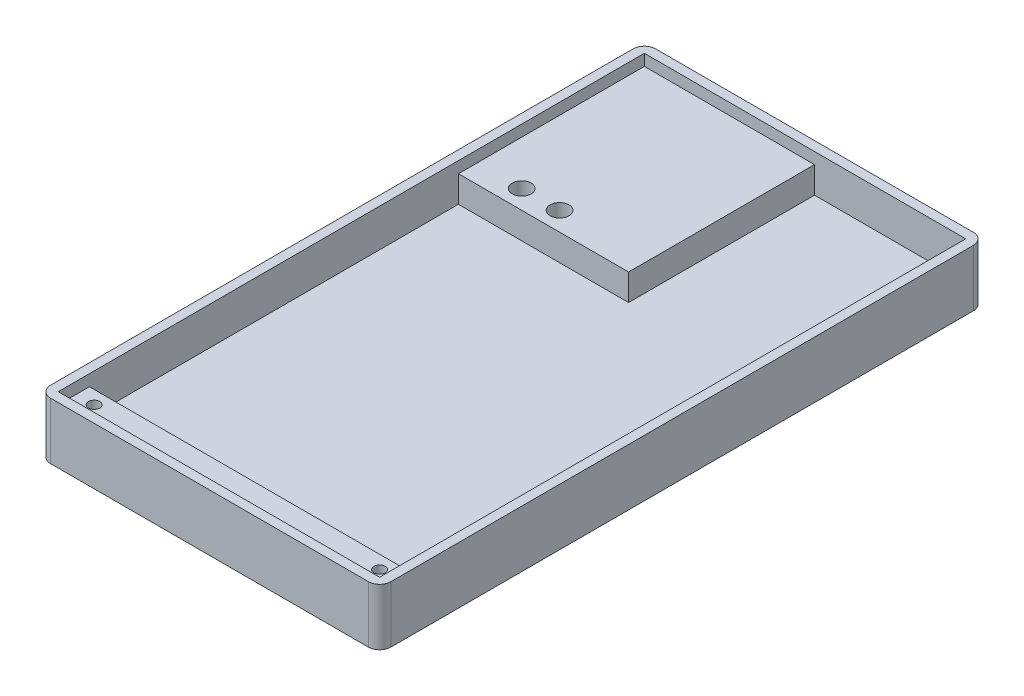
ISO-10303-21;
HEADER;
FILE_DESCRIPTION(('STEP AP214'),'2;1');
FILE_NAME('part.step','',(''),(''),'','','');
FILE_SCHEMA(('AUTOMOTIVE_DESIGN { 1 0 10303 214 1 1 1 1 }'));
ENDSEC;
DATA;
#1=APPLICATION_CONTEXT('core data for automotive mechanical design processes');
#2=APPLICATION_PROTOCOL_DEFINITION('international standard','automotive_design',2000,#1);
#3=PRODUCT_CONTEXT('',#1,'mechanical');
#4=PRODUCT('Part','Part','',(#3));
#5=PRODUCT_RELATED_PRODUCT_CATEGORY('part','',(#4));
#6=PRODUCT_DEFINITION_FORMATION('','',#4);
#7=PRODUCT_DEFINITION_CONTEXT('part definition',#1,'design');
#8=PRODUCT_DEFINITION('design','',#6,#7);
#9=PRODUCT_DEFINITION_SHAPE('','',#8);
#10=(LENGTH_UNIT() NAMED_UNIT(*) SI_UNIT(.MILLI.,.METRE.));
#11=(NAMED_UNIT(*) PLANE_ANGLE_UNIT() SI_UNIT($,.RADIAN.));
#12=(NAMED_UNIT(*) SI_UNIT($,.STERADIAN.) SOLID_ANGLE_UNIT());
#13=UNCERTAINTY_MEASURE_WITH_UNIT(LENGTH_MEASURE(1.E-05),#10,'distance_accuracy_value','');
#14=(GEOMETRIC_REPRESENTATION_CONTEXT(3) GLOBAL_UNCERTAINTY_ASSIGNED_CONTEXT((#13)) GLOBAL_UNIT_ASSIGNED_CONTEXT((#10,
#11,#12)) REPRESENTATION_CONTEXT('',''));
#15=CARTESIAN_POINT('',(0.,0.,0.));
#16=DIRECTION('',(0.,0.,1.));
#17=DIRECTION('',(1.,0.,0.));
#18=AXIS2_PLACEMENT_3D('',#15,#16,#17);
#19=CARTESIAN_POINT('',(-40.7731376975169,15.,-49.3058690744921));
#20=DIRECTION('',(1.,0.,0.));
#21=DIRECTION('',(0.,0.,-1.));
#22=AXIS2_PLACEMENT_3D('',#19,#20,#21);
#23=PLANE('',#22);
#24=DIRECTION('',(0.,0.,1.));
#25=VECTOR('',#24,1.);
#26=CARTESIAN_POINT('',(-40.7731376975169,5.,-49.3058690744921));
#27=LINE('',#26,#25);
#28=CARTESIAN_POINT('',(-40.7731376975169,5.,-0.130869074492097));
#29=VERTEX_POINT('',#28);
#30=CARTESIAN_POINT('',(-40.7731376975169,5.,97.4441309255079));
#31=VERTEX_POINT('',#30);
#32=EDGE_CURVE('E481',#29,#31,#27,.T.);
#33=ORIENTED_EDGE('',*,*,#32,.F.);
#34=DIRECTION('',(0.,-1.,0.));
#35=VECTOR('',#34,1.);
#36=CARTESIAN_POINT('',(-40.7731376975169,78.657187346902,-0.130869074492097));
#37=LINE('',#36,#35);
#38=CARTESIAN_POINT('',(-40.7731376975169,12.,-0.130869074492097));
#39=VERTEX_POINT('',#38);
#40=EDGE_CURVE('E186',#39,#29,#37,.T.);
#41=ORIENTED_EDGE('',*,*,#40,.F.);
#42=DIRECTION('',(0.,0.,-1.));
#43=VECTOR('',#42,1.);
#44=CARTESIAN_POINT('',(-40.7731376975169,12.,0.));
#45=LINE('',#44,#43);
#46=CARTESIAN_POINT('',(-40.7731376975169,12.,-49.3058690744921));
#47=VERTEX_POINT('',#46);
#48=EDGE_CURVE('E168',#39,#47,#45,.T.);
#49=ORIENTED_EDGE('',*,*,#48,.T.);
#50=DIRECTION('',(0.,-1.,0.));
#51=VECTOR('',#50,1.);
#52=CARTESIAN_POINT('',(-40.7731376975169,15.,-49.3058690744921));
#53=LINE('',#52,#51);
#54=CARTESIAN_POINT('',(-40.7731376975169,15.,-49.3058690744921));
#55=VERTEX_POINT('',#54);
#56=EDGE_CURVE('E184',#55,#47,#53,.T.);
#57=ORIENTED_EDGE('',*,*,#56,.F.);
#58=DIRECTION('',(0.,0.,1.));
#59=VECTOR('',#58,1.);
#60=CARTESIAN_POINT('',(-40.7731376975169,15.,-49.3058690744921));
#61=LINE('',#60,#59);
#62=CARTESIAN_POINT('',(-40.7731376975169,15.,105.694130925508));
#63=VERTEX_POINT('',#62);
#64=EDGE_CURVE('E492',#55,#63,#61,.T.);
#65=ORIENTED_EDGE('',*,*,#64,.T.);
#66=DIRECTION('',(0.,-1.,0.));
#67=VECTOR('',#66,1.);
#68=CARTESIAN_POINT('',(-40.7731376975169,15.,105.694130925508));
#69=LINE('',#68,#67);
#70=CARTESIAN_POINT('',(-40.7731376975169,12.,105.694130925508));
#71=VERTEX_POINT('',#70);
#72=EDGE_CURVE('E211',#63,#71,#69,.T.);
#73=ORIENTED_EDGE('',*,*,#72,.T.);
#74=DIRECTION('',(0.,0.,1.));
#75=VECTOR('',#74,1.);
#76=CARTESIAN_POINT('',(-40.7731376975169,12.,105.694130925508));
#77=LINE('',#76,#75);
#78=CARTESIAN_POINT('',(-40.7731376975169,12.,97.4441309255079));
#79=VERTEX_POINT('',#78);
#80=EDGE_CURVE('E534',#79,#71,#77,.T.);
#81=ORIENTED_EDGE('',*,*,#80,.F.);
#82=DIRECTION('',(0.,-1.,0.));
#83=VECTOR('',#82,1.);
#84=CARTESIAN_POINT('',(-40.7731376975169,12.,97.4441309255079));
#85=LINE('',#84,#83);
#86=EDGE_CURVE('E482',#79,#31,#85,.T.);
#87=ORIENTED_EDGE('',*,*,#86,.T.);
#88=EDGE_LOOP('',(#33,#41,#49,#57,#65,#73,#81,#87));
#89=FACE_BOUND('',#88,.T.);
#90=ADVANCED_FACE('F45',(#89),#23,.T.);
#91=CARTESIAN_POINT('',(-40.7731376975169,15.,-49.3058690744921));
#92=DIRECTION('',(0.,0.,1.));
#93=DIRECTION('',(1.,0.,0.));
#94=AXIS2_PLACEMENT_3D('',#91,#92,#93);
#95=PLANE('',#94);
#96=DIRECTION('',(1.,0.,0.));
#97=VECTOR('',#96,1.);
#98=CARTESIAN_POINT('',(0.,12.,-49.3058690744921));
#99=LINE('',#98,#97);
#100=CARTESIAN_POINT('',(4.22686230248306,12.,-49.3058690744921));
#101=VERTEX_POINT('',#100);
#102=EDGE_CURVE('E165',#47,#101,#99,.T.);
#103=ORIENTED_EDGE('',*,*,#102,.T.);
#104=DIRECTION('',(0.,-1.,0.));
#105=VECTOR('',#104,1.);
#106=CARTESIAN_POINT('',(4.22686230248306,78.657187346902,-49.3058690744921));
#107=LINE('',#106,#105);
#108=CARTESIAN_POINT('',(4.22686230248306,5.,-49.3058690744921));
#109=VERTEX_POINT('',#108);
#110=EDGE_CURVE('E177',#101,#109,#107,.T.);
#111=ORIENTED_EDGE('',*,*,#110,.T.);
#112=DIRECTION('',(-1.,0.,0.));
#113=VECTOR('',#112,1.);
#114=CARTESIAN_POINT('',(-40.7731376975169,5.,-49.3058690744921));
#115=LINE('',#114,#113);
#116=CARTESIAN_POINT('',(44.2268623024831,5.,-49.3058690744921));
#117=VERTEX_POINT('',#116);
#118=EDGE_CURVE('E205',#117,#109,#115,.T.);
#119=ORIENTED_EDGE('',*,*,#118,.F.);
#120=DIRECTION('',(0.,-1.,0.));
#121=VECTOR('',#120,1.);
#122=CARTESIAN_POINT('',(44.2268623024831,15.,-49.3058690744921));
#123=LINE('',#122,#121);
#124=CARTESIAN_POINT('',(44.2268623024831,15.,-49.3058690744921));
#125=VERTEX_POINT('',#124);
#126=EDGE_CURVE('E195',#125,#117,#123,.T.);
#127=ORIENTED_EDGE('',*,*,#126,.F.);
#128=DIRECTION('',(-1.,0.,0.));
#129=VECTOR('',#128,1.);
#130=CARTESIAN_POINT('',(-40.7731376975169,15.,-49.3058690744921));
#131=LINE('',#130,#129);
#132=EDGE_CURVE('E193',#125,#55,#131,.T.);
#133=ORIENTED_EDGE('',*,*,#132,.T.);
#134=ORIENTED_EDGE('',*,*,#56,.T.);
#135=EDGE_LOOP('',(#103,#111,#119,#127,#133,#134));
#136=FACE_BOUND('',#135,.T.);
#137=ADVANCED_FACE('F191',(#136),#95,.T.);
#138=CARTESIAN_POINT('',(-40.7731376975169,15.,105.694130925508));
#139=DIRECTION('',(0.,0.,-1.));
#140=DIRECTION('',(-1.,0.,0.));
#141=AXIS2_PLACEMENT_3D('',#138,#139,#140);
#142=PLANE('',#141);
#143=DIRECTION('',(0.,-1.,0.));
#144=VECTOR('',#143,1.);
#145=CARTESIAN_POINT('',(44.2268623024831,15.,105.694130925508));
#146=LINE('',#145,#144);
#147=CARTESIAN_POINT('',(44.2268623024831,15.,105.694130925508));
#148=VERTEX_POINT('',#147);
#149=CARTESIAN_POINT('',(44.2268623024831,12.,105.694130925508));
#150=VERTEX_POINT('',#149);
#151=EDGE_CURVE('E200',#148,#150,#146,.T.);
#152=ORIENTED_EDGE('',*,*,#151,.T.);
#153=DIRECTION('',(1.,0.,0.));
#154=VECTOR('',#153,1.);
#155=CARTESIAN_POINT('',(-40.7731376975169,12.,105.694130925508));
#156=LINE('',#155,#154);
#157=EDGE_CURVE('E537',#71,#150,#156,.T.);
#158=ORIENTED_EDGE('',*,*,#157,.F.);
#159=ORIENTED_EDGE('',*,*,#72,.F.);
#160=DIRECTION('',(1.,0.,0.));
#161=VECTOR('',#160,1.);
#162=CARTESIAN_POINT('',(-40.7731376975169,15.,105.694130925508));
#163=LINE('',#162,#161);
#164=EDGE_CURVE('E495',#63,#148,#163,.T.);
#165=ORIENTED_EDGE('',*,*,#164,.T.);
#166=EDGE_LOOP('',(#152,#158,#159,#165));
#167=FACE_BOUND('',#166,.T.);
#168=ADVANCED_FACE('F343',(#167),#142,.T.);
#169=CARTESIAN_POINT('',(44.2268623024831,15.,-49.3058690744921));
#170=DIRECTION('',(-1.,0.,0.));
#171=DIRECTION('',(0.,0.,1.));
#172=AXIS2_PLACEMENT_3D('',#169,#170,#171);
#173=PLANE('',#172);
#174=DIRECTION('',(0.,-1.,0.));
#175=VECTOR('',#174,1.);
#176=CARTESIAN_POINT('',(44.2268623024831,12.,97.4441309255079));
#177=LINE('',#176,#175);
#178=CARTESIAN_POINT('',(44.2268623024831,12.,97.4441309255079));
#179=VERTEX_POINT('',#178);
#180=CARTESIAN_POINT('',(44.2268623024831,5.,97.4441309255079));
#181=VERTEX_POINT('',#180);
#182=EDGE_CURVE('E473',#179,#181,#177,.T.);
#183=ORIENTED_EDGE('',*,*,#182,.F.);
#184=DIRECTION('',(0.,0.,-1.));
#185=VECTOR('',#184,1.);
#186=CARTESIAN_POINT('',(44.2268623024831,12.,105.694130925508));
#187=LINE('',#186,#185);
#188=EDGE_CURVE('E475',#150,#179,#187,.T.);
#189=ORIENTED_EDGE('',*,*,#188,.F.);
#190=ORIENTED_EDGE('',*,*,#151,.F.);
#191=DIRECTION('',(0.,0.,-1.));
#192=VECTOR('',#191,1.);
#193=CARTESIAN_POINT('',(44.2268623024831,15.,-49.3058690744921));
#194=LINE('',#193,#192);
#195=EDGE_CURVE('E202',#148,#125,#194,.T.);
#196=ORIENTED_EDGE('',*,*,#195,.T.);
#197=ORIENTED_EDGE('',*,*,#126,.T.);
#198=DIRECTION('',(0.,0.,-1.));
#199=VECTOR('',#198,1.);
#200=CARTESIAN_POINT('',(44.2268623024831,5.,-49.3058690744921));
#201=LINE('',#200,#199);
#202=EDGE_CURVE('E476',#181,#117,#201,.T.);
#203=ORIENTED_EDGE('',*,*,#202,.F.);
#204=EDGE_LOOP('',(#183,#189,#190,#196,#197,#203));
#205=FACE_BOUND('',#204,.T.);
#206=ADVANCED_FACE('F365',(#205),#173,.T.);
#207=CARTESIAN_POINT('',(-43.2731376975169,5.,-51.8058690744921));
#208=DIRECTION('',(1.,0.,0.));
#209=DIRECTION('',(0.,0.,-1.));
#210=AXIS2_PLACEMENT_3D('',#207,#208,#209);
#211=PLANE('',#210);
#212=DIRECTION('',(0.,0.,1.));
#213=VECTOR('',#212,1.);
#214=CARTESIAN_POINT('',(-43.2731376975169,15.,-51.8058690744921));
#215=LINE('',#214,#213);
#216=CARTESIAN_POINT('',(-43.2731376975169,15.,-48.8058690744921));
#217=VERTEX_POINT('',#216);
#218=CARTESIAN_POINT('',(-43.2731376975169,15.,105.194130925508));
#219=VERTEX_POINT('',#218);
#220=EDGE_CURVE('E215',#217,#219,#215,.T.);
#221=ORIENTED_EDGE('',*,*,#220,.F.);
#222=DIRECTION('',(0.,-1.,0.));
#223=VECTOR('',#222,1.);
#224=CARTESIAN_POINT('',(-43.2731376975169,0.,-48.8058690744921));
#225=LINE('',#224,#223);
#226=CARTESIAN_POINT('',(-43.2731376975169,0.,-48.8058690744921));
#227=VERTEX_POINT('',#226);
#228=EDGE_CURVE('E252',#217,#227,#225,.T.);
#229=ORIENTED_EDGE('',*,*,#228,.T.);
#230=DIRECTION('',(0.,0.,1.));
#231=VECTOR('',#230,1.);
#232=CARTESIAN_POINT('',(-43.2731376975169,0.,-51.8058690744921));
#233=LINE('',#232,#231);
#234=CARTESIAN_POINT('',(-43.2731376975169,0.,105.194130925508));
#235=VERTEX_POINT('',#234);
#236=EDGE_CURVE('E229',#227,#235,#233,.T.);
#237=ORIENTED_EDGE('',*,*,#236,.T.);
#238=DIRECTION('',(0.,-1.,0.));
#239=VECTOR('',#238,1.);
#240=CARTESIAN_POINT('',(-43.2731376975169,5.,105.194130925508));
#241=LINE('',#240,#239);
#242=EDGE_CURVE('E245',#235,#219,#241,.F.);
#243=ORIENTED_EDGE('',*,*,#242,.T.);
#244=EDGE_LOOP('',(#221,#229,#237,#243));
#245=FACE_BOUND('',#244,.T.);
#246=ADVANCED_FACE('F325',(#245),#211,.F.);
#247=CARTESIAN_POINT('',(-43.2731376975169,5.,108.194130925508));
#248=DIRECTION('',(0.,0.,-1.));
#249=DIRECTION('',(-1.,0.,0.));
#250=AXIS2_PLACEMENT_3D('',#247,#248,#249);
#251=PLANE('',#250);
#252=DIRECTION('',(1.,0.,0.));
#253=VECTOR('',#252,1.);
#254=CARTESIAN_POINT('',(-43.2731376975169,0.,108.194130925508));
#255=LINE('',#254,#253);
#256=CARTESIAN_POINT('',(-40.2731376975169,0.,108.194130925508));
#257=VERTEX_POINT('',#256);
#258=CARTESIAN_POINT('',(43.7268623024831,0.,108.194130925508));
#259=VERTEX_POINT('',#258);
#260=EDGE_CURVE('E233',#257,#259,#255,.T.);
#261=ORIENTED_EDGE('',*,*,#260,.T.);
#262=DIRECTION('',(0.,-1.,0.));
#263=VECTOR('',#262,1.);
#264=CARTESIAN_POINT('',(43.7268623024831,15.,108.194130925508));
#265=LINE('',#264,#263);
#266=CARTESIAN_POINT('',(43.7268623024831,15.,108.194130925508));
#267=VERTEX_POINT('',#266);
#268=EDGE_CURVE('E11',#259,#267,#265,.F.);
#269=ORIENTED_EDGE('',*,*,#268,.T.);
#270=DIRECTION('',(1.,0.,0.));
#271=VECTOR('',#270,1.);
#272=CARTESIAN_POINT('',(-43.2731376975169,15.,108.194130925508));
#273=LINE('',#272,#271);
#274=CARTESIAN_POINT('',(-40.2731376975169,15.,108.194130925508));
#275=VERTEX_POINT('',#274);
#276=EDGE_CURVE('E219',#275,#267,#273,.T.);
#277=ORIENTED_EDGE('',*,*,#276,.F.);
#278=DIRECTION('',(0.,-1.,0.));
#279=VECTOR('',#278,1.);
#280=CARTESIAN_POINT('',(-40.2731376975169,5.,108.194130925508));
#281=LINE('',#280,#279);
#282=EDGE_CURVE('E54',#275,#257,#281,.T.);
#283=ORIENTED_EDGE('',*,*,#282,.T.);
#284=EDGE_LOOP('',(#261,#269,#277,#283));
#285=FACE_BOUND('',#284,.T.);
#286=ADVANCED_FACE('F297',(#285),#251,.F.);
#287=CARTESIAN_POINT('',(46.7268623024831,5.,-51.8058690744921));
#288=DIRECTION('',(1.,0.,0.));
#289=DIRECTION('',(0.,0.,-1.));
#290=AXIS2_PLACEMENT_3D('',#287,#288,#289);
#291=PLANE('',#290);
#292=DIRECTION('',(0.,0.,1.));
#293=VECTOR('',#292,1.);
#294=CARTESIAN_POINT('',(46.7268623024831,0.,-51.8058690744921));
#295=LINE('',#294,#293);
#296=CARTESIAN_POINT('',(46.7268623024831,0.,-48.8058690744921));
#297=VERTEX_POINT('',#296);
#298=CARTESIAN_POINT('',(46.7268623024831,0.,105.194130925508));
#299=VERTEX_POINT('',#298);
#300=EDGE_CURVE('E237',#297,#299,#295,.T.);
#301=ORIENTED_EDGE('',*,*,#300,.F.);
#302=DIRECTION('',(0.,-1.,0.));
#303=VECTOR('',#302,1.);
#304=CARTESIAN_POINT('',(46.7268623024831,5.,-48.8058690744921));
#305=LINE('',#304,#303);
#306=CARTESIAN_POINT('',(46.7268623024831,15.,-48.8058690744921));
#307=VERTEX_POINT('',#306);
#308=EDGE_CURVE('E61',#297,#307,#305,.F.);
#309=ORIENTED_EDGE('',*,*,#308,.T.);
#310=DIRECTION('',(0.,0.,-1.));
#311=VECTOR('',#310,1.);
#312=CARTESIAN_POINT('',(46.7268623024831,15.,-51.8058690744921));
#313=LINE('',#312,#311);
#314=CARTESIAN_POINT('',(46.7268623024831,15.,105.194130925508));
#315=VERTEX_POINT('',#314);
#316=EDGE_CURVE('E222',#315,#307,#313,.T.);
#317=ORIENTED_EDGE('',*,*,#316,.F.);
#318=DIRECTION('',(0.,-1.,0.));
#319=VECTOR('',#318,1.);
#320=CARTESIAN_POINT('',(46.7268623024831,0.,105.194130925508));
#321=LINE('',#320,#319);
#322=EDGE_CURVE('E286',#315,#299,#321,.T.);
#323=ORIENTED_EDGE('',*,*,#322,.T.);
#324=EDGE_LOOP('',(#301,#309,#317,#323));
#325=FACE_BOUND('',#324,.T.);
#326=ADVANCED_FACE('F307',(#325),#291,.T.);
#327=CARTESIAN_POINT('',(-43.2731376975169,5.,-51.8058690744921));
#328=DIRECTION('',(0.,0.,-1.));
#329=DIRECTION('',(-1.,0.,0.));
#330=AXIS2_PLACEMENT_3D('',#327,#328,#329);
#331=PLANE('',#330);
#332=DIRECTION('',(1.,0.,0.));
#333=VECTOR('',#332,1.);
#334=CARTESIAN_POINT('',(-43.2731376975169,0.,-51.8058690744921));
#335=LINE('',#334,#333);
#336=CARTESIAN_POINT('',(-40.2731376975169,0.,-51.8058690744921));
#337=VERTEX_POINT('',#336);
#338=CARTESIAN_POINT('',(43.726862302483,0.,-51.8058690744921));
#339=VERTEX_POINT('',#338);
#340=EDGE_CURVE('E241',#337,#339,#335,.T.);
#341=ORIENTED_EDGE('',*,*,#340,.F.);
#342=DIRECTION('',(0.,-1.,0.));
#343=VECTOR('',#342,1.);
#344=CARTESIAN_POINT('',(-40.2731376975169,15.,-51.8058690744921));
#345=LINE('',#344,#343);
#346=CARTESIAN_POINT('',(-40.2731376975169,15.,-51.8058690744921));
#347=VERTEX_POINT('',#346);
#348=EDGE_CURVE('E272',#337,#347,#345,.F.);
#349=ORIENTED_EDGE('',*,*,#348,.T.);
#350=DIRECTION('',(-1.,0.,0.));
#351=VECTOR('',#350,1.);
#352=CARTESIAN_POINT('',(-43.2731376975169,15.,-51.8058690744921));
#353=LINE('',#352,#351);
#354=CARTESIAN_POINT('',(43.7268623024831,15.,-51.8058690744921));
#355=VERTEX_POINT('',#354);
#356=EDGE_CURVE('E225',#355,#347,#353,.T.);
#357=ORIENTED_EDGE('',*,*,#356,.F.);
#358=DIRECTION('',(0.,-1.,0.));
#359=VECTOR('',#358,1.);
#360=CARTESIAN_POINT('',(43.7268623024831,5.,-51.8058690744921));
#361=LINE('',#360,#359);
#362=EDGE_CURVE('E268',#355,#339,#361,.T.);
#363=ORIENTED_EDGE('',*,*,#362,.T.);
#364=EDGE_LOOP('',(#341,#349,#357,#363));
#365=FACE_BOUND('',#364,.T.);
#366=ADVANCED_FACE('F317',(#365),#331,.T.);
#367=CARTESIAN_POINT('',(0.,0.,0.));
#368=DIRECTION('',(0.,1.,0.));
#369=DIRECTION('',(0.,0.,1.));
#370=AXIS2_PLACEMENT_3D('',#367,#368,#369);
#371=PLANE('',#370);
#372=CARTESIAN_POINT('',(39.4768623024831,0.,100.944130925508));
#373=DIRECTION('',(0.,1.,0.));
#374=DIRECTION('',(0.,0.,1.));
#375=AXIS2_PLACEMENT_3D('',#372,#373,#374);
#376=CIRCLE('',#375,1.5);
#377=CARTESIAN_POINT('',(39.4768623024831,0.,102.444130925508));
#378=VERTEX_POINT('',#377);
#379=EDGE_CURVE('E557',#378,#378,#376,.T.);
#380=ORIENTED_EDGE('',*,*,#379,.T.);
#381=EDGE_LOOP('',(#380));
#382=FACE_BOUND('',#381,.T.);
#383=CARTESIAN_POINT('',(-36.0231376975169,0.,100.944130925508));
#384=DIRECTION('',(0.,1.,0.));
#385=DIRECTION('',(0.,0.,1.));
#386=AXIS2_PLACEMENT_3D('',#383,#384,#385);
#387=CIRCLE('',#386,1.5);
#388=CARTESIAN_POINT('',(-36.0231376975169,0.,102.444130925508));
#389=VERTEX_POINT('',#388);
#390=EDGE_CURVE('E559',#389,#389,#387,.T.);
#391=ORIENTED_EDGE('',*,*,#390,.T.);
#392=EDGE_LOOP('',(#391));
#393=FACE_BOUND('',#392,.T.);
#394=CARTESIAN_POINT('',(-29.0231376975169,0.,-5.1308690744921));
#395=DIRECTION('',(0.,1.,0.));
#396=DIRECTION('',(0.,0.,1.));
#397=AXIS2_PLACEMENT_3D('',#394,#395,#396);
#398=CIRCLE('',#397,2.55926668016734);
#399=CARTESIAN_POINT('',(-29.0231376975169,0.,-2.57160239432475));
#400=VERTEX_POINT('',#399);
#401=EDGE_CURVE('E563',#400,#400,#398,.T.);
#402=ORIENTED_EDGE('',*,*,#401,.T.);
#403=EDGE_LOOP('',(#402));
#404=FACE_BOUND('',#403,.T.);
#405=CARTESIAN_POINT('',(-19.0231376975169,0.,-5.1308690744921));
#406=DIRECTION('',(0.,1.,0.));
#407=DIRECTION('',(0.,0.,1.));
#408=AXIS2_PLACEMENT_3D('',#405,#406,#407);
#409=CIRCLE('',#408,2.5);
#410=CARTESIAN_POINT('',(-19.0231376975169,0.,-2.6308690744921));
#411=VERTEX_POINT('',#410);
#412=EDGE_CURVE('E249',#411,#411,#409,.T.);
#413=ORIENTED_EDGE('',*,*,#412,.T.);
#414=EDGE_LOOP('',(#413));
#415=FACE_BOUND('',#414,.T.);
#416=ORIENTED_EDGE('',*,*,#236,.F.);
#417=CARTESIAN_POINT('',(-40.2731376975169,0.,-48.8058690744921));
#418=DIRECTION('',(0.,1.,0.));
#419=DIRECTION('',(0.,0.,1.));
#420=AXIS2_PLACEMENT_3D('',#417,#418,#419);
#421=CIRCLE('',#420,3.);
#422=EDGE_CURVE('E265',#227,#337,#421,.F.);
#423=ORIENTED_EDGE('',*,*,#422,.T.);
#424=ORIENTED_EDGE('',*,*,#340,.T.);
#425=CARTESIAN_POINT('',(43.7268623024831,0.,-48.8058690744921));
#426=DIRECTION('',(0.,1.,0.));
#427=DIRECTION('',(0.,0.,1.));
#428=AXIS2_PLACEMENT_3D('',#425,#426,#427);
#429=CIRCLE('',#428,3.);
#430=EDGE_CURVE('E262',#339,#297,#429,.F.);
#431=ORIENTED_EDGE('',*,*,#430,.T.);
#432=ORIENTED_EDGE('',*,*,#300,.T.);
#433=CARTESIAN_POINT('',(43.7268623024831,0.,105.194130925508));
#434=DIRECTION('',(0.,1.,0.));
#435=DIRECTION('',(0.,0.,1.));
#436=AXIS2_PLACEMENT_3D('',#433,#434,#435);
#437=CIRCLE('',#436,3.);
#438=EDGE_CURVE('E259',#299,#259,#437,.F.);
#439=ORIENTED_EDGE('',*,*,#438,.T.);
#440=ORIENTED_EDGE('',*,*,#260,.F.);
#441=CARTESIAN_POINT('',(-40.2731376975169,0.,105.194130925508));
#442=DIRECTION('',(0.,1.,0.));
#443=DIRECTION('',(0.,0.,1.));
#444=AXIS2_PLACEMENT_3D('',#441,#442,#443);
#445=CIRCLE('',#444,3.);
#446=EDGE_CURVE('E256',#257,#235,#445,.F.);
#447=ORIENTED_EDGE('',*,*,#446,.T.);
#448=EDGE_LOOP('',(#416,#423,#424,#431,#432,#439,#440,#447));
#449=FACE_BOUND('',#448,.T.);
#450=ADVANCED_FACE('F303',(#382,#393,#404,#415,#449),#371,.F.);
#451=CARTESIAN_POINT('',(0.,15.,0.));
#452=DIRECTION('',(0.,1.,0.));
#453=DIRECTION('',(0.,0.,1.));
#454=AXIS2_PLACEMENT_3D('',#451,#452,#453);
#455=PLANE('',#454);
#456=ORIENTED_EDGE('',*,*,#356,.T.);
#457=CARTESIAN_POINT('',(-40.2731376975169,15.,-48.8058690744921));
#458=DIRECTION('',(0.,1.,0.));
#459=DIRECTION('',(0.,0.,1.));
#460=AXIS2_PLACEMENT_3D('',#457,#458,#459);
#461=CIRCLE('',#460,3.);
#462=EDGE_CURVE('E283',#347,#217,#461,.T.);
#463=ORIENTED_EDGE('',*,*,#462,.T.);
#464=ORIENTED_EDGE('',*,*,#220,.T.);
#465=CARTESIAN_POINT('',(-40.2731376975169,15.,105.194130925508));
#466=DIRECTION('',(0.,1.,0.));
#467=DIRECTION('',(0.,0.,1.));
#468=AXIS2_PLACEMENT_3D('',#465,#466,#467);
#469=CIRCLE('',#468,3.);
#470=EDGE_CURVE('E275',#219,#275,#469,.T.);
#471=ORIENTED_EDGE('',*,*,#470,.T.);
#472=ORIENTED_EDGE('',*,*,#276,.T.);
#473=CARTESIAN_POINT('',(43.7268623024831,15.,105.194130925508));
#474=DIRECTION('',(0.,1.,0.));
#475=DIRECTION('',(0.,0.,1.));
#476=AXIS2_PLACEMENT_3D('',#473,#474,#475);
#477=CIRCLE('',#476,3.);
#478=EDGE_CURVE('E68',#267,#315,#477,.T.);
#479=ORIENTED_EDGE('',*,*,#478,.T.);
#480=ORIENTED_EDGE('',*,*,#316,.T.);
#481=CARTESIAN_POINT('',(43.7268623024831,15.,-48.8058690744921));
#482=DIRECTION('',(0.,1.,0.));
#483=DIRECTION('',(0.,0.,1.));
#484=AXIS2_PLACEMENT_3D('',#481,#482,#483);
#485=CIRCLE('',#484,3.);
#486=EDGE_CURVE('E280',#307,#355,#485,.T.);
#487=ORIENTED_EDGE('',*,*,#486,.T.);
#488=EDGE_LOOP('',(#456,#463,#464,#471,#472,#479,#480,#487));
#489=FACE_BOUND('',#488,.T.);
#490=ORIENTED_EDGE('',*,*,#164,.F.);
#491=ORIENTED_EDGE('',*,*,#64,.F.);
#492=ORIENTED_EDGE('',*,*,#132,.F.);
#493=ORIENTED_EDGE('',*,*,#195,.F.);
#494=EDGE_LOOP('',(#490,#491,#492,#493));
#495=FACE_BOUND('',#494,.T.);
#496=ADVANCED_FACE('F309',(#489,#495),#455,.T.);
#497=CARTESIAN_POINT('',(0.,5.,0.));
#498=DIRECTION('',(0.,1.,0.));
#499=DIRECTION('',(0.,0.,1.));
#500=AXIS2_PLACEMENT_3D('',#497,#498,#499);
#501=PLANE('',#500);
#502=DIRECTION('',(0.,0.,-1.));
#503=VECTOR('',#502,1.);
#504=CARTESIAN_POINT('',(4.22686230248306,5.,0.));
#505=LINE('',#504,#503);
#506=CARTESIAN_POINT('',(4.22686230248306,5.,-0.130869074492095));
#507=VERTEX_POINT('',#506);
#508=EDGE_CURVE('E178',#507,#109,#505,.T.);
#509=ORIENTED_EDGE('',*,*,#508,.F.);
#510=DIRECTION('',(1.,0.,0.));
#511=VECTOR('',#510,1.);
#512=CARTESIAN_POINT('',(0.,5.,-0.130869074492095));
#513=LINE('',#512,#511);
#514=EDGE_CURVE('E520',#29,#507,#513,.T.);
#515=ORIENTED_EDGE('',*,*,#514,.F.);
#516=ORIENTED_EDGE('',*,*,#32,.T.);
#517=DIRECTION('',(-1.,0.,0.));
#518=VECTOR('',#517,1.);
#519=CARTESIAN_POINT('',(-40.7731376975169,5.,97.4441309255079));
#520=LINE('',#519,#518);
#521=EDGE_CURVE('E533',#181,#31,#520,.T.);
#522=ORIENTED_EDGE('',*,*,#521,.F.);
#523=ORIENTED_EDGE('',*,*,#202,.T.);
#524=ORIENTED_EDGE('',*,*,#118,.T.);
#525=EDGE_LOOP('',(#509,#515,#516,#522,#523,#524));
#526=FACE_BOUND('',#525,.T.);
#527=ADVANCED_FACE('F350',(#526),#501,.T.);
#528=CARTESIAN_POINT('',(0.,12.,0.));
#529=DIRECTION('',(0.,-1.,0.));
#530=DIRECTION('',(0.,0.,-1.));
#531=AXIS2_PLACEMENT_3D('',#528,#529,#530);
#532=PLANE('',#531);
#533=ORIENTED_EDGE('',*,*,#80,.T.);
#534=ORIENTED_EDGE('',*,*,#157,.T.);
#535=ORIENTED_EDGE('',*,*,#188,.T.);
#536=DIRECTION('',(-1.,0.,0.));
#537=VECTOR('',#536,1.);
#538=CARTESIAN_POINT('',(-40.7731376975169,12.,97.4441309255079));
#539=LINE('',#538,#537);
#540=EDGE_CURVE('E488',#179,#79,#539,.T.);
#541=ORIENTED_EDGE('',*,*,#540,.T.);
#542=EDGE_LOOP('',(#533,#534,#535,#541));
#543=FACE_BOUND('',#542,.T.);
#544=CARTESIAN_POINT('',(-36.0231376975169,12.,100.944130925508));
#545=DIRECTION('',(0.,1.,0.));
#546=DIRECTION('',(0.,0.,1.));
#547=AXIS2_PLACEMENT_3D('',#544,#545,#546);
#548=CIRCLE('',#547,1.5);
#549=CARTESIAN_POINT('',(-36.0231376975169,12.,102.444130925508));
#550=VERTEX_POINT('',#549);
#551=EDGE_CURVE('E529',#550,#550,#548,.T.);
#552=ORIENTED_EDGE('',*,*,#551,.F.);
#553=EDGE_LOOP('',(#552));
#554=FACE_BOUND('',#553,.T.);
#555=CARTESIAN_POINT('',(39.4768623024831,12.,100.944130925508));
#556=DIRECTION('',(0.,1.,0.));
#557=DIRECTION('',(0.,0.,1.));
#558=AXIS2_PLACEMENT_3D('',#555,#556,#557);
#559=CIRCLE('',#558,1.5);
#560=CARTESIAN_POINT('',(39.4768623024831,12.,102.444130925508));
#561=VERTEX_POINT('',#560);
#562=EDGE_CURVE('E525',#561,#561,#559,.T.);
#563=ORIENTED_EDGE('',*,*,#562,.F.);
#564=EDGE_LOOP('',(#563));
#565=FACE_BOUND('',#564,.T.);
#566=ADVANCED_FACE('F353',(#543,#554,#565),#532,.F.);
#567=CARTESIAN_POINT('',(-40.7731376975169,12.,97.4441309255079));
#568=DIRECTION('',(0.,0.,1.));
#569=DIRECTION('',(1.,0.,0.));
#570=AXIS2_PLACEMENT_3D('',#567,#568,#569);
#571=PLANE('',#570);
#572=ORIENTED_EDGE('',*,*,#521,.T.);
#573=ORIENTED_EDGE('',*,*,#86,.F.);
#574=ORIENTED_EDGE('',*,*,#540,.F.);
#575=ORIENTED_EDGE('',*,*,#182,.T.);
#576=EDGE_LOOP('',(#572,#573,#574,#575));
#577=FACE_BOUND('',#576,.T.);
#578=ADVANCED_FACE('F395',(#577),#571,.F.);
#579=CARTESIAN_POINT('',(-36.0231376975169,12.,100.944130925508));
#580=DIRECTION('',(0.,-1.,0.));
#581=DIRECTION('',(0.,0.,-1.));
#582=AXIS2_PLACEMENT_3D('',#579,#580,#581);
#583=CYLINDRICAL_SURFACE('',#582,1.5);
#584=ORIENTED_EDGE('',*,*,#551,.T.);
#585=EDGE_LOOP('',(#584));
#586=FACE_BOUND('',#585,.T.);
#587=ORIENTED_EDGE('',*,*,#390,.F.);
#588=EDGE_LOOP('',(#587));
#589=FACE_BOUND('',#588,.T.);
#590=ADVANCED_FACE('F388',(#586,#589),#583,.F.);
#591=CARTESIAN_POINT('',(39.4768623024831,12.,100.944130925508));
#592=DIRECTION('',(0.,-1.,0.));
#593=DIRECTION('',(0.,0.,-1.));
#594=AXIS2_PLACEMENT_3D('',#591,#592,#593);
#595=CYLINDRICAL_SURFACE('',#594,1.5);
#596=ORIENTED_EDGE('',*,*,#562,.T.);
#597=EDGE_LOOP('',(#596));
#598=FACE_BOUND('',#597,.T.);
#599=ORIENTED_EDGE('',*,*,#379,.F.);
#600=EDGE_LOOP('',(#599));
#601=FACE_BOUND('',#600,.T.);
#602=ADVANCED_FACE('F394',(#598,#601),#595,.F.);
#603=CARTESIAN_POINT('',(0.,78.657187346902,-0.130869074492095));
#604=DIRECTION('',(0.,0.,-1.));
#605=DIRECTION('',(-1.,0.,0.));
#606=AXIS2_PLACEMENT_3D('',#603,#604,#605);
#607=PLANE('',#606);
#608=DIRECTION('',(0.,-1.,0.));
#609=VECTOR('',#608,1.);
#610=CARTESIAN_POINT('',(4.22686230248306,78.657187346902,-0.130869074492095));
#611=LINE('',#610,#609);
#612=CARTESIAN_POINT('',(4.22686230248306,12.,-0.130869074492095));
#613=VERTEX_POINT('',#612);
#614=EDGE_CURVE('E514',#613,#507,#611,.T.);
#615=ORIENTED_EDGE('',*,*,#614,.F.);
#616=DIRECTION('',(-1.,0.,0.));
#617=VECTOR('',#616,1.);
#618=CARTESIAN_POINT('',(0.,12.,-0.130869074492095));
#619=LINE('',#618,#617);
#620=EDGE_CURVE('E188',#613,#39,#619,.T.);
#621=ORIENTED_EDGE('',*,*,#620,.T.);
#622=ORIENTED_EDGE('',*,*,#40,.T.);
#623=ORIENTED_EDGE('',*,*,#514,.T.);
#624=EDGE_LOOP('',(#615,#621,#622,#623));
#625=FACE_BOUND('',#624,.T.);
#626=ADVANCED_FACE('F408',(#625),#607,.F.);
#627=CARTESIAN_POINT('',(4.22686230248306,78.657187346902,0.));
#628=DIRECTION('',(-1.,0.,0.));
#629=DIRECTION('',(0.,0.,1.));
#630=AXIS2_PLACEMENT_3D('',#627,#628,#629);
#631=PLANE('',#630);
#632=ORIENTED_EDGE('',*,*,#110,.F.);
#633=DIRECTION('',(0.,0.,1.));
#634=VECTOR('',#633,1.);
#635=CARTESIAN_POINT('',(4.22686230248306,12.,0.));
#636=LINE('',#635,#634);
#637=EDGE_CURVE('E171',#101,#613,#636,.T.);
#638=ORIENTED_EDGE('',*,*,#637,.T.);
#639=ORIENTED_EDGE('',*,*,#614,.T.);
#640=ORIENTED_EDGE('',*,*,#508,.T.);
#641=EDGE_LOOP('',(#632,#638,#639,#640));
#642=FACE_BOUND('',#641,.T.);
#643=ADVANCED_FACE('F423',(#642),#631,.F.);
#644=CARTESIAN_POINT('',(-19.0231376975169,78.657187346902,-5.1308690744921));
#645=DIRECTION('',(0.,-1.,0.));
#646=DIRECTION('',(0.,0.,-1.));
#647=AXIS2_PLACEMENT_3D('',#644,#645,#646);
#648=CYLINDRICAL_SURFACE('',#647,2.5);
#649=CARTESIAN_POINT('',(-19.0231376975169,12.,-5.1308690744921));
#650=DIRECTION('',(0.,-1.,0.));
#651=DIRECTION('',(0.,0.,-1.));
#652=AXIS2_PLACEMENT_3D('',#649,#650,#651);
#653=CIRCLE('',#652,2.5);
#654=CARTESIAN_POINT('',(-19.0231376975169,12.,-7.6308690744921));
#655=VERTEX_POINT('',#654);
#656=EDGE_CURVE('E507',#655,#655,#653,.T.);
#657=ORIENTED_EDGE('',*,*,#656,.F.);
#658=EDGE_LOOP('',(#657));
#659=FACE_BOUND('',#658,.T.);
#660=ORIENTED_EDGE('',*,*,#412,.F.);
#661=EDGE_LOOP('',(#660));
#662=FACE_BOUND('',#661,.T.);
#663=ADVANCED_FACE('F417',(#659,#662),#648,.F.);
#664=CARTESIAN_POINT('',(-29.0231376975169,78.657187346902,-5.1308690744921));
#665=DIRECTION('',(0.,-1.,0.));
#666=DIRECTION('',(0.,0.,-1.));
#667=AXIS2_PLACEMENT_3D('',#664,#665,#666);
#668=CYLINDRICAL_SURFACE('',#667,2.5);
#669=CARTESIAN_POINT('',(-29.0231376975169,12.,-5.1308690744921));
#670=DIRECTION('',(0.,-1.,0.));
#671=DIRECTION('',(0.,0.,-1.));
#672=AXIS2_PLACEMENT_3D('',#669,#670,#671);
#673=CIRCLE('',#672,2.5);
#674=CARTESIAN_POINT('',(-29.0231376975169,12.,-7.63086907449209));
#675=VERTEX_POINT('',#674);
#676=EDGE_CURVE('E511',#675,#675,#673,.T.);
#677=ORIENTED_EDGE('',*,*,#676,.F.);
#678=EDGE_LOOP('',(#677));
#679=FACE_BOUND('',#678,.T.);
#680=CARTESIAN_POINT('',(-29.0231376975169,5.,-5.1308690744921));
#681=DIRECTION('',(0.,1.,0.));
#682=DIRECTION('',(0.,0.,1.));
#683=AXIS2_PLACEMENT_3D('',#680,#681,#682);
#684=CIRCLE('',#683,2.5);
#685=CARTESIAN_POINT('',(-29.0231376975169,5.,-2.6308690744921));
#686=VERTEX_POINT('',#685);
#687=EDGE_CURVE('E189',#686,#686,#684,.F.);
#688=ORIENTED_EDGE('',*,*,#687,.T.);
#689=EDGE_LOOP('',(#688));
#690=FACE_BOUND('',#689,.T.);
#691=ADVANCED_FACE('F422',(#679,#690),#668,.F.);
#692=CARTESIAN_POINT('',(0.,12.,0.));
#693=DIRECTION('',(0.,-1.,0.));
#694=DIRECTION('',(0.,0.,-1.));
#695=AXIS2_PLACEMENT_3D('',#692,#693,#694);
#696=PLANE('',#695);
#697=ORIENTED_EDGE('',*,*,#656,.T.);
#698=EDGE_LOOP('',(#697));
#699=FACE_BOUND('',#698,.T.);
#700=ORIENTED_EDGE('',*,*,#676,.T.);
#701=EDGE_LOOP('',(#700));
#702=FACE_BOUND('',#701,.T.);
#703=ORIENTED_EDGE('',*,*,#620,.F.);
#704=ORIENTED_EDGE('',*,*,#637,.F.);
#705=ORIENTED_EDGE('',*,*,#102,.F.);
#706=ORIENTED_EDGE('',*,*,#48,.F.);
#707=EDGE_LOOP('',(#703,#704,#705,#706));
#708=FACE_BOUND('',#707,.T.);
#709=ADVANCED_FACE('F167',(#699,#702,#708),#696,.F.);
#710=CARTESIAN_POINT('',(-40.2731376975169,5.,-48.8058690744921));
#711=DIRECTION('',(0.,1.,0.));
#712=DIRECTION('',(0.,0.,1.));
#713=AXIS2_PLACEMENT_3D('',#710,#711,#712);
#714=CYLINDRICAL_SURFACE('',#713,3.);
#715=ORIENTED_EDGE('',*,*,#462,.F.);
#716=ORIENTED_EDGE('',*,*,#348,.F.);
#717=ORIENTED_EDGE('',*,*,#422,.F.);
#718=ORIENTED_EDGE('',*,*,#228,.F.);
#719=EDGE_LOOP('',(#715,#716,#717,#718));
#720=FACE_BOUND('',#719,.T.);
#721=ADVANCED_FACE('F322',(#720),#714,.T.);
#722=CARTESIAN_POINT('',(43.7268623024831,5.,-48.8058690744921));
#723=DIRECTION('',(0.,-1.,0.));
#724=DIRECTION('',(0.,0.,-1.));
#725=AXIS2_PLACEMENT_3D('',#722,#723,#724);
#726=CYLINDRICAL_SURFACE('',#725,3.);
#727=ORIENTED_EDGE('',*,*,#486,.F.);
#728=ORIENTED_EDGE('',*,*,#308,.F.);
#729=ORIENTED_EDGE('',*,*,#430,.F.);
#730=ORIENTED_EDGE('',*,*,#362,.F.);
#731=EDGE_LOOP('',(#727,#728,#729,#730));
#732=FACE_BOUND('',#731,.T.);
#733=ADVANCED_FACE('F314',(#732),#726,.T.);
#734=CARTESIAN_POINT('',(43.7268623024831,5.,105.194130925508));
#735=DIRECTION('',(0.,1.,0.));
#736=DIRECTION('',(0.,0.,1.));
#737=AXIS2_PLACEMENT_3D('',#734,#735,#736);
#738=CYLINDRICAL_SURFACE('',#737,3.);
#739=ORIENTED_EDGE('',*,*,#478,.F.);
#740=ORIENTED_EDGE('',*,*,#268,.F.);
#741=ORIENTED_EDGE('',*,*,#438,.F.);
#742=ORIENTED_EDGE('',*,*,#322,.F.);
#743=EDGE_LOOP('',(#739,#740,#741,#742));
#744=FACE_BOUND('',#743,.T.);
#745=ADVANCED_FACE('F306',(#744),#738,.T.);
#746=CARTESIAN_POINT('',(-40.2731376975169,5.,105.194130925508));
#747=DIRECTION('',(0.,-1.,0.));
#748=DIRECTION('',(0.,0.,-1.));
#749=AXIS2_PLACEMENT_3D('',#746,#747,#748);
#750=CYLINDRICAL_SURFACE('',#749,3.);
#751=ORIENTED_EDGE('',*,*,#470,.F.);
#752=ORIENTED_EDGE('',*,*,#242,.F.);
#753=ORIENTED_EDGE('',*,*,#446,.F.);
#754=ORIENTED_EDGE('',*,*,#282,.F.);
#755=EDGE_LOOP('',(#751,#752,#753,#754));
#756=FACE_BOUND('',#755,.T.);
#757=ADVANCED_FACE('F47',(#756),#750,.T.);
#758=CARTESIAN_POINT('',(-29.0231376975169,5.,-5.1308690744921));
#759=DIRECTION('',(0.,1.,0.));
#760=DIRECTION('',(0.,0.,1.));
#761=AXIS2_PLACEMENT_3D('',#758,#759,#760);
#762=PLANE('',#761);
#763=CARTESIAN_POINT('',(-29.0231376975169,5.,-5.1308690744921));
#764=DIRECTION('',(0.,1.,0.));
#765=DIRECTION('',(0.,0.,1.));
#766=AXIS2_PLACEMENT_3D('',#763,#764,#765);
#767=CIRCLE('',#766,2.55926668016734);
#768=CARTESIAN_POINT('',(-29.0231376975169,5.,-2.57160239432475));
#769=VERTEX_POINT('',#768);
#770=EDGE_CURVE('E570',#769,#769,#767,.T.);
#771=ORIENTED_EDGE('',*,*,#770,.F.);
#772=EDGE_LOOP('',(#771));
#773=FACE_BOUND('',#772,.T.);
#774=ORIENTED_EDGE('',*,*,#687,.F.);
#775=EDGE_LOOP('',(#774));
#776=FACE_BOUND('',#775,.T.);
#777=ADVANCED_FACE('F328',(#773,#776),#762,.F.);
#778=CARTESIAN_POINT('',(-29.0231376975169,0.,-5.1308690744921));
#779=DIRECTION('',(0.,1.,0.));
#780=DIRECTION('',(0.,0.,1.));
#781=AXIS2_PLACEMENT_3D('',#778,#779,#780);
#782=CYLINDRICAL_SURFACE('',#781,2.55926668016734);
#783=ORIENTED_EDGE('',*,*,#401,.F.);
#784=EDGE_LOOP('',(#783));
#785=FACE_BOUND('',#784,.T.);
#786=ORIENTED_EDGE('',*,*,#770,.T.);
#787=EDGE_LOOP('',(#786));
#788=FACE_BOUND('',#787,.T.);
#789=ADVANCED_FACE('F334',(#785,#788),#782,.F.);
#790=CLOSED_SHELL('',(#90,#137,#168,#206,#246,#286,#326,#366,#450,#496,#527,#566,#578,#590,#602,
#626,#643,#663,#691,#709,#721,#733,#745,#757,#777,#789));
#791=MANIFOLD_SOLID_BREP('B2',#790);
#792=ADVANCED_BREP_SHAPE_REPRESENTATION('',(#18,#791),#14);
#793=SHAPE_DEFINITION_REPRESENTATION(#9,#792);
ENDSEC;
END-ISO-10303-21;
